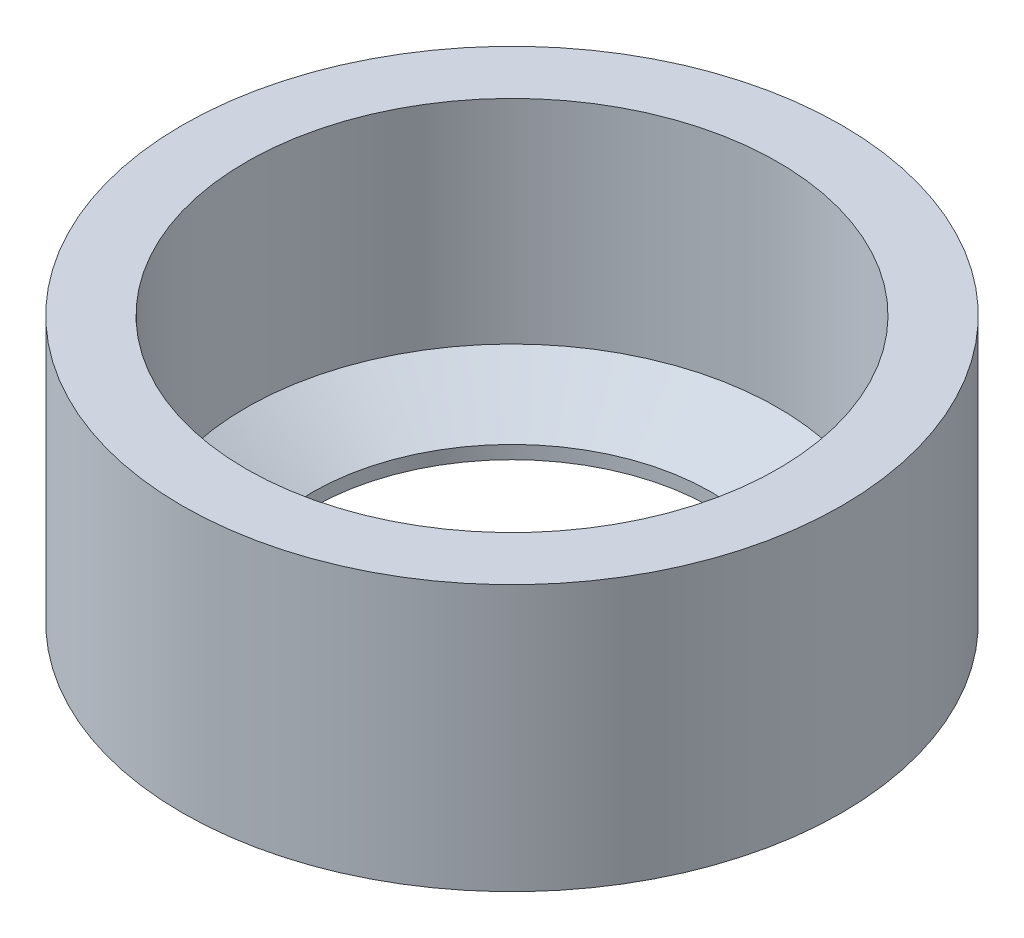
ISO-10303-21;
HEADER;
FILE_DESCRIPTION(('STEP AP214'),'2;1');
FILE_NAME('part.step','',(''),(''),'','','');
FILE_SCHEMA(('AUTOMOTIVE_DESIGN { 1 0 10303 214 1 1 1 1 }'));
ENDSEC;
DATA;
#1=APPLICATION_CONTEXT('core data for automotive mechanical design processes');
#2=APPLICATION_PROTOCOL_DEFINITION('international standard','automotive_design',2000,#1);
#3=PRODUCT_CONTEXT('',#1,'mechanical');
#4=PRODUCT('Part','Part','',(#3));
#5=PRODUCT_RELATED_PRODUCT_CATEGORY('part','',(#4));
#6=PRODUCT_DEFINITION_FORMATION('','',#4);
#7=PRODUCT_DEFINITION_CONTEXT('part definition',#1,'design');
#8=PRODUCT_DEFINITION('design','',#6,#7);
#9=PRODUCT_DEFINITION_SHAPE('','',#8);
#10=(LENGTH_UNIT() NAMED_UNIT(*) SI_UNIT(.MILLI.,.METRE.));
#11=(NAMED_UNIT(*) PLANE_ANGLE_UNIT() SI_UNIT($,.RADIAN.));
#12=(NAMED_UNIT(*) SI_UNIT($,.STERADIAN.) SOLID_ANGLE_UNIT());
#13=UNCERTAINTY_MEASURE_WITH_UNIT(LENGTH_MEASURE(1.E-05),#10,'distance_accuracy_value','');
#14=(GEOMETRIC_REPRESENTATION_CONTEXT(3) GLOBAL_UNCERTAINTY_ASSIGNED_CONTEXT((#13)) GLOBAL_UNIT_ASSIGNED_CONTEXT((#10,
#11,#12)) REPRESENTATION_CONTEXT('',''));
#15=CARTESIAN_POINT('',(0.,0.,0.));
#16=DIRECTION('',(0.,0.,1.));
#17=DIRECTION('',(1.,0.,0.));
#18=AXIS2_PLACEMENT_3D('',#15,#16,#17);
#19=CARTESIAN_POINT('',(0.,12.7,0.));
#20=DIRECTION('',(0.,-1.,0.));
#21=DIRECTION('',(0.,0.,-1.));
#22=AXIS2_PLACEMENT_3D('',#19,#20,#21);
#23=CYLINDRICAL_SURFACE('',#22,15.748);
#24=CARTESIAN_POINT('',(0.,12.7,0.));
#25=DIRECTION('',(0.,1.,0.));
#26=DIRECTION('',(0.,0.,1.));
#27=AXIS2_PLACEMENT_3D('',#24,#25,#26);
#28=CIRCLE('',#27,15.748);
#29=CARTESIAN_POINT('',(0.,12.7,15.748));
#30=VERTEX_POINT('',#29);
#31=EDGE_CURVE('E10',#30,#30,#28,.T.);
#32=ORIENTED_EDGE('',*,*,#31,.F.);
#33=EDGE_LOOP('',(#32));
#34=FACE_BOUND('',#33,.T.);
#35=CARTESIAN_POINT('',(0.,0.,0.));
#36=DIRECTION('',(0.,1.,0.));
#37=DIRECTION('',(0.,0.,1.));
#38=AXIS2_PLACEMENT_3D('',#35,#36,#37);
#39=CIRCLE('',#38,15.748);
#40=CARTESIAN_POINT('',(0.,0.,15.748));
#41=VERTEX_POINT('',#40);
#42=EDGE_CURVE('E46',#41,#41,#39,.T.);
#43=ORIENTED_EDGE('',*,*,#42,.T.);
#44=EDGE_LOOP('',(#43));
#45=FACE_BOUND('',#44,.T.);
#46=ADVANCED_FACE('F39',(#34,#45),#23,.T.);
#47=CARTESIAN_POINT('',(0.,12.7,0.));
#48=DIRECTION('',(0.,1.,0.));
#49=DIRECTION('',(0.,0.,1.));
#50=AXIS2_PLACEMENT_3D('',#47,#48,#49);
#51=PLANE('',#50);
#52=CARTESIAN_POINT('',(0.,12.7,0.));
#53=DIRECTION('',(0.,1.,0.));
#54=DIRECTION('',(0.,0.,1.));
#55=AXIS2_PLACEMENT_3D('',#52,#53,#54);
#56=CIRCLE('',#55,12.7);
#57=CARTESIAN_POINT('',(0.,12.7,12.7));
#58=VERTEX_POINT('',#57);
#59=EDGE_CURVE('E55',#58,#58,#56,.T.);
#60=ORIENTED_EDGE('',*,*,#59,.F.);
#61=EDGE_LOOP('',(#60));
#62=FACE_BOUND('',#61,.T.);
#63=ORIENTED_EDGE('',*,*,#31,.T.);
#64=EDGE_LOOP('',(#63));
#65=FACE_BOUND('',#64,.T.);
#66=ADVANCED_FACE('F80',(#62,#65),#51,.T.);
#67=CARTESIAN_POINT('',(0.,0.,0.));
#68=DIRECTION('',(0.,1.,0.));
#69=DIRECTION('',(0.,0.,1.));
#70=AXIS2_PLACEMENT_3D('',#67,#68,#69);
#71=PLANE('',#70);
#72=CARTESIAN_POINT('',(0.,0.,0.));
#73=DIRECTION('',(0.,1.,0.));
#74=DIRECTION('',(0.,0.,1.));
#75=AXIS2_PLACEMENT_3D('',#72,#73,#74);
#76=CIRCLE('',#75,9.525);
#77=CARTESIAN_POINT('',(0.,0.,9.525));
#78=VERTEX_POINT('',#77);
#79=EDGE_CURVE('E58',#78,#78,#76,.T.);
#80=ORIENTED_EDGE('',*,*,#79,.T.);
#81=EDGE_LOOP('',(#80));
#82=FACE_BOUND('',#81,.T.);
#83=ORIENTED_EDGE('',*,*,#42,.F.);
#84=EDGE_LOOP('',(#83));
#85=FACE_BOUND('',#84,.T.);
#86=ADVANCED_FACE('F85',(#82,#85),#71,.F.);
#87=CARTESIAN_POINT('',(0.,2.54,0.));
#88=DIRECTION('',(0.,1.,0.));
#89=DIRECTION('',(0.,0.,1.));
#90=AXIS2_PLACEMENT_3D('',#87,#88,#89);
#91=CONICAL_SURFACE('',#90,12.7,1.02974425867665);
#92=CARTESIAN_POINT('',(0.,0.632267534587491,0.));
#93=DIRECTION('',(0.,1.,0.));
#94=DIRECTION('',(0.,0.,1.));
#95=AXIS2_PLACEMENT_3D('',#92,#93,#94);
#96=CIRCLE('',#95,9.52499999999999);
#97=CARTESIAN_POINT('',(0.,0.632267534587491,9.52499999999999));
#98=VERTEX_POINT('',#97);
#99=EDGE_CURVE('E42',#98,#98,#96,.F.);
#100=ORIENTED_EDGE('',*,*,#99,.T.);
#101=EDGE_LOOP('',(#100));
#102=FACE_BOUND('',#101,.T.);
#103=CARTESIAN_POINT('',(0.,2.54,0.));
#104=DIRECTION('',(0.,1.,0.));
#105=DIRECTION('',(0.,0.,1.));
#106=AXIS2_PLACEMENT_3D('',#103,#104,#105);
#107=CIRCLE('',#106,12.7);
#108=CARTESIAN_POINT('',(0.,2.54,12.7));
#109=VERTEX_POINT('',#108);
#110=EDGE_CURVE('E51',#109,#109,#107,.T.);
#111=ORIENTED_EDGE('',*,*,#110,.T.);
#112=EDGE_LOOP('',(#111));
#113=FACE_BOUND('',#112,.T.);
#114=ADVANCED_FACE('F65',(#102,#113),#91,.F.);
#115=CARTESIAN_POINT('',(0.,12.7,0.));
#116=DIRECTION('',(0.,1.,0.));
#117=DIRECTION('',(0.,0.,1.));
#118=AXIS2_PLACEMENT_3D('',#115,#116,#117);
#119=CYLINDRICAL_SURFACE('',#118,12.7);
#120=ORIENTED_EDGE('',*,*,#110,.F.);
#121=EDGE_LOOP('',(#120));
#122=FACE_BOUND('',#121,.T.);
#123=ORIENTED_EDGE('',*,*,#59,.T.);
#124=EDGE_LOOP('',(#123));
#125=FACE_BOUND('',#124,.T.);
#126=ADVANCED_FACE('F70',(#122,#125),#119,.F.);
#127=CARTESIAN_POINT('',(0.,12.7,0.));
#128=DIRECTION('',(0.,1.,0.));
#129=DIRECTION('',(0.,0.,1.));
#130=AXIS2_PLACEMENT_3D('',#127,#128,#129);
#131=CYLINDRICAL_SURFACE('',#130,9.52499999999999);
#132=ORIENTED_EDGE('',*,*,#79,.F.);
#133=EDGE_LOOP('',(#132));
#134=FACE_BOUND('',#133,.T.);
#135=ORIENTED_EDGE('',*,*,#99,.F.);
#136=EDGE_LOOP('',(#135));
#137=FACE_BOUND('',#136,.T.);
#138=ADVANCED_FACE('F68',(#134,#137),#131,.F.);
#139=CLOSED_SHELL('',(#46,#66,#86,#114,#126,#138));
#140=MANIFOLD_SOLID_BREP('B2',#139);
#141=ADVANCED_BREP_SHAPE_REPRESENTATION('',(#18,#140),#14);
#142=SHAPE_DEFINITION_REPRESENTATION(#9,#141);
ENDSEC;
END-ISO-10303-21;
